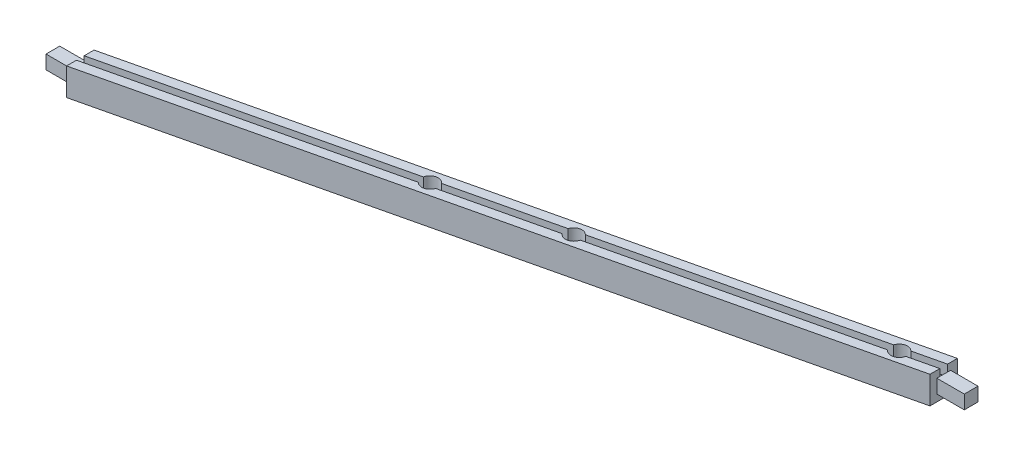
ISO-10303-21;
HEADER;
FILE_DESCRIPTION(('STEP AP214'),'2;1');
FILE_NAME('part.step','',(''),(''),'','','');
FILE_SCHEMA(('AUTOMOTIVE_DESIGN { 1 0 10303 214 1 1 1 1 }'));
ENDSEC;
DATA;
#1=APPLICATION_CONTEXT('core data for automotive mechanical design processes');
#2=APPLICATION_PROTOCOL_DEFINITION('international standard','automotive_design',2000,#1);
#3=PRODUCT_CONTEXT('',#1,'mechanical');
#4=PRODUCT('Part','Part','',(#3));
#5=PRODUCT_RELATED_PRODUCT_CATEGORY('part','',(#4));
#6=PRODUCT_DEFINITION_FORMATION('','',#4);
#7=PRODUCT_DEFINITION_CONTEXT('part definition',#1,'design');
#8=PRODUCT_DEFINITION('design','',#6,#7);
#9=PRODUCT_DEFINITION_SHAPE('','',#8);
#10=(LENGTH_UNIT() NAMED_UNIT(*) SI_UNIT(.MILLI.,.METRE.));
#11=(NAMED_UNIT(*) PLANE_ANGLE_UNIT() SI_UNIT($,.RADIAN.));
#12=(NAMED_UNIT(*) SI_UNIT($,.STERADIAN.) SOLID_ANGLE_UNIT());
#13=UNCERTAINTY_MEASURE_WITH_UNIT(LENGTH_MEASURE(1.E-05),#10,'distance_accuracy_value','');
#14=(GEOMETRIC_REPRESENTATION_CONTEXT(3) GLOBAL_UNCERTAINTY_ASSIGNED_CONTEXT((#13)) GLOBAL_UNIT_ASSIGNED_CONTEXT((#10,
#11,#12)) REPRESENTATION_CONTEXT('',''));
#15=CARTESIAN_POINT('',(0.,0.,0.));
#16=DIRECTION('',(0.,0.,1.));
#17=DIRECTION('',(1.,0.,0.));
#18=AXIS2_PLACEMENT_3D('',#15,#16,#17);
#19=CARTESIAN_POINT('',(0.,5.,0.));
#20=DIRECTION('',(0.,1.,0.));
#21=DIRECTION('',(0.,0.,1.));
#22=AXIS2_PLACEMENT_3D('',#19,#20,#21);
#23=PLANE('',#22);
#24=DIRECTION('',(-0.973336888209918,0.,0.22938025645167));
#25=VECTOR('',#24,1.);
#26=CARTESIAN_POINT('',(127.3,5.,-33.2020613610787));
#27=LINE('',#26,#25);
#28=CARTESIAN_POINT('',(127.3,5.,-33.2020613610787));
#29=VERTEX_POINT('',#28);
#30=CARTESIAN_POINT('',(121.892366515107,5.,-31.9276779789358));
#31=VERTEX_POINT('',#30);
#32=EDGE_CURVE('E268',#29,#31,#27,.T.);
#33=ORIENTED_EDGE('',*,*,#32,.F.);
#34=DIRECTION('',(0.,0.,-1.));
#35=VECTOR('',#34,1.);
#36=CARTESIAN_POINT('',(127.3,5.,0.));
#37=LINE('',#36,#35);
#38=CARTESIAN_POINT('',(127.3,5.,-35.));
#39=VERTEX_POINT('',#38);
#40=EDGE_CURVE('E410',#29,#39,#37,.T.);
#41=ORIENTED_EDGE('',*,*,#40,.T.);
#42=DIRECTION('',(-0.973336888209918,0.,0.22938025645167));
#43=VECTOR('',#42,1.);
#44=CARTESIAN_POINT('',(-1.11632132515731,5.,-4.73692348975083));
#45=LINE('',#44,#43);
#46=CARTESIAN_POINT('',(0.,5.,-5.));
#47=VERTEX_POINT('',#46);
#48=EDGE_CURVE('E409',#39,#47,#45,.T.);
#49=ORIENTED_EDGE('',*,*,#48,.T.);
#50=DIRECTION('',(0.,0.,-1.));
#51=VECTOR('',#50,1.);
#52=CARTESIAN_POINT('',(0.,5.,0.));
#53=LINE('',#52,#51);
#54=CARTESIAN_POINT('',(0.,5.,-3.20206136107874));
#55=VERTEX_POINT('',#54);
#56=EDGE_CURVE('E413',#55,#47,#53,.T.);
#57=ORIENTED_EDGE('',*,*,#56,.F.);
#58=CARTESIAN_POINT('',(50.0276332522524,5.,-14.9917628345082));
#59=VERTEX_POINT('',#58);
#60=EDGE_CURVE('E272',#59,#55,#27,.T.);
#61=ORIENTED_EDGE('',*,*,#60,.F.);
#62=CARTESIAN_POINT('',(51.5,5.,-14.7051687659598));
#63=DIRECTION('',(0.,-1.,0.));
#64=DIRECTION('',(0.,0.,-1.));
#65=AXIS2_PLACEMENT_3D('',#62,#63,#64);
#66=CIRCLE('',#65,1.5);
#67=CARTESIAN_POINT('',(52.6894562772722,5.,-15.6190581271287));
#68=VERTEX_POINT('',#67);
#69=EDGE_CURVE('E315',#59,#68,#66,.T.);
#70=ORIENTED_EDGE('',*,*,#69,.T.);
#71=CARTESIAN_POINT('',(71.3635631002158,5.,-20.0198688473825));
#72=VERTEX_POINT('',#71);
#73=EDGE_CURVE('E802',#72,#68,#27,.T.);
#74=ORIENTED_EDGE('',*,*,#73,.F.);
#75=CARTESIAN_POINT('',(72.8,5.,-19.5878398750457));
#76=DIRECTION('',(0.,-1.,0.));
#77=DIRECTION('',(0.,0.,-1.));
#78=AXIS2_PLACEMENT_3D('',#75,#76,#77);
#79=CIRCLE('',#78,1.5);
#80=CARTESIAN_POINT('',(73.8923665151067,5.,-20.6158162350238));
#81=VERTEX_POINT('',#80);
#82=EDGE_CURVE('E323',#72,#81,#79,.T.);
#83=ORIENTED_EDGE('',*,*,#82,.T.);
#84=CARTESIAN_POINT('',(119.363563100216,5.,-31.3317305912946));
#85=VERTEX_POINT('',#84);
#86=EDGE_CURVE('E271',#85,#81,#27,.T.);
#87=ORIENTED_EDGE('',*,*,#86,.F.);
#88=CARTESIAN_POINT('',(120.8,5.,-30.8997016189577));
#89=DIRECTION('',(0.,-1.,0.));
#90=DIRECTION('',(0.,0.,-1.));
#91=AXIS2_PLACEMENT_3D('',#88,#89,#90);
#92=CIRCLE('',#91,1.5);
#93=EDGE_CURVE('E330',#85,#31,#92,.T.);
#94=ORIENTED_EDGE('',*,*,#93,.T.);
#95=EDGE_LOOP('',(#33,#41,#49,#57,#61,#70,#74,#83,#87,#94));
#96=FACE_BOUND('',#95,.T.);
#97=ADVANCED_FACE('F37',(#96),#23,.T.);
#98=CARTESIAN_POINT('',(127.3,5.,0.));
#99=DIRECTION('',(-1.,0.,0.));
#100=DIRECTION('',(0.,0.,1.));
#101=AXIS2_PLACEMENT_3D('',#98,#99,#100);
#102=PLANE('',#101);
#103=ORIENTED_EDGE('',*,*,#40,.F.);
#104=DIRECTION('',(0.,1.,0.));
#105=VECTOR('',#104,1.);
#106=CARTESIAN_POINT('',(127.3,3.,-33.2020613610787));
#107=LINE('',#106,#105);
#108=CARTESIAN_POINT('',(127.3,3.75,-33.2020613610787));
#109=VERTEX_POINT('',#108);
#110=EDGE_CURVE('E279',#109,#29,#107,.T.);
#111=ORIENTED_EDGE('',*,*,#110,.F.);
#112=DIRECTION('',(0.,0.,1.));
#113=VECTOR('',#112,1.);
#114=CARTESIAN_POINT('',(127.3,3.75,-31.25));
#115=LINE('',#114,#113);
#116=CARTESIAN_POINT('',(127.3,3.75,-33.75));
#117=VERTEX_POINT('',#116);
#118=EDGE_CURVE('E375',#117,#109,#115,.T.);
#119=ORIENTED_EDGE('',*,*,#118,.F.);
#120=DIRECTION('',(0.,1.,0.));
#121=VECTOR('',#120,1.);
#122=CARTESIAN_POINT('',(127.3,3.75,-33.75));
#123=LINE('',#122,#121);
#124=CARTESIAN_POINT('',(127.3,1.25,-33.75));
#125=VERTEX_POINT('',#124);
#126=EDGE_CURVE('E387',#125,#117,#123,.T.);
#127=ORIENTED_EDGE('',*,*,#126,.F.);
#128=DIRECTION('',(0.,0.,-1.));
#129=VECTOR('',#128,1.);
#130=CARTESIAN_POINT('',(127.3,1.25,-31.25));
#131=LINE('',#130,#129);
#132=CARTESIAN_POINT('',(127.3,1.25,-31.25));
#133=VERTEX_POINT('',#132);
#134=EDGE_CURVE('E384',#133,#125,#131,.T.);
#135=ORIENTED_EDGE('',*,*,#134,.F.);
#136=DIRECTION('',(0.,-1.,0.));
#137=VECTOR('',#136,1.);
#138=CARTESIAN_POINT('',(127.3,3.75,-31.25));
#139=LINE('',#138,#137);
#140=CARTESIAN_POINT('',(127.3,3.75,-31.25));
#141=VERTEX_POINT('',#140);
#142=EDGE_CURVE('E370',#141,#133,#139,.T.);
#143=ORIENTED_EDGE('',*,*,#142,.F.);
#144=CARTESIAN_POINT('',(127.3,3.75,-31.7979386389213));
#145=VERTEX_POINT('',#144);
#146=EDGE_CURVE('E390',#145,#141,#115,.T.);
#147=ORIENTED_EDGE('',*,*,#146,.F.);
#148=DIRECTION('',(0.,1.,0.));
#149=VECTOR('',#148,1.);
#150=CARTESIAN_POINT('',(127.3,3.,-31.7979386389213));
#151=LINE('',#150,#149);
#152=CARTESIAN_POINT('',(127.3,5.,-31.7979386389213));
#153=VERTEX_POINT('',#152);
#154=EDGE_CURVE('E283',#145,#153,#151,.T.);
#155=ORIENTED_EDGE('',*,*,#154,.T.);
#156=CARTESIAN_POINT('',(127.3,5.,-30.));
#157=VERTEX_POINT('',#156);
#158=EDGE_CURVE('E406',#157,#153,#37,.T.);
#159=ORIENTED_EDGE('',*,*,#158,.F.);
#160=DIRECTION('',(0.,-1.,0.));
#161=VECTOR('',#160,1.);
#162=CARTESIAN_POINT('',(127.3,5.,-30.));
#163=LINE('',#162,#161);
#164=CARTESIAN_POINT('',(127.3,0.,-30.));
#165=VERTEX_POINT('',#164);
#166=EDGE_CURVE('E419',#157,#165,#163,.T.);
#167=ORIENTED_EDGE('',*,*,#166,.T.);
#168=DIRECTION('',(0.,0.,-1.));
#169=VECTOR('',#168,1.);
#170=CARTESIAN_POINT('',(127.3,0.,0.));
#171=LINE('',#170,#169);
#172=CARTESIAN_POINT('',(127.3,0.,-35.));
#173=VERTEX_POINT('',#172);
#174=EDGE_CURVE('E405',#165,#173,#171,.T.);
#175=ORIENTED_EDGE('',*,*,#174,.T.);
#176=DIRECTION('',(0.,-1.,0.));
#177=VECTOR('',#176,1.);
#178=CARTESIAN_POINT('',(127.3,5.,-35.));
#179=LINE('',#178,#177);
#180=EDGE_CURVE('E436',#39,#173,#179,.T.);
#181=ORIENTED_EDGE('',*,*,#180,.F.);
#182=EDGE_LOOP('',(#103,#111,#119,#127,#135,#143,#147,#155,#159,#167,#175,#181));
#183=FACE_BOUND('',#182,.T.);
#184=ADVANCED_FACE('F39',(#183),#102,.F.);
#185=CARTESIAN_POINT('',(-1.11632132515731,5.,-4.73692348975083));
#186=DIRECTION('',(0.22938025645167,0.,0.973336888209918));
#187=DIRECTION('',(0.973336888209918,0.,-0.22938025645167));
#188=AXIS2_PLACEMENT_3D('',#185,#186,#187);
#189=PLANE('',#188);
#190=DIRECTION('',(-0.973336888209918,0.,0.22938025645167));
#191=VECTOR('',#190,1.);
#192=CARTESIAN_POINT('',(-1.11632132515731,0.,-4.73692348975083));
#193=LINE('',#192,#191);
#194=CARTESIAN_POINT('',(0.,0.,-5.));
#195=VERTEX_POINT('',#194);
#196=EDGE_CURVE('E422',#173,#195,#193,.T.);
#197=ORIENTED_EDGE('',*,*,#196,.T.);
#198=DIRECTION('',(0.,-1.,0.));
#199=VECTOR('',#198,1.);
#200=CARTESIAN_POINT('',(0.,5.,-5.));
#201=LINE('',#200,#199);
#202=EDGE_CURVE('E434',#47,#195,#201,.T.);
#203=ORIENTED_EDGE('',*,*,#202,.F.);
#204=ORIENTED_EDGE('',*,*,#48,.F.);
#205=ORIENTED_EDGE('',*,*,#180,.T.);
#206=EDGE_LOOP('',(#197,#203,#204,#205));
#207=FACE_BOUND('',#206,.T.);
#208=ADVANCED_FACE('F493',(#207),#189,.F.);
#209=CARTESIAN_POINT('',(0.,5.,0.));
#210=DIRECTION('',(-1.,0.,0.));
#211=DIRECTION('',(0.,0.,1.));
#212=AXIS2_PLACEMENT_3D('',#209,#210,#211);
#213=PLANE('',#212);
#214=DIRECTION('',(0.,1.,0.));
#215=VECTOR('',#214,1.);
#216=CARTESIAN_POINT('',(0.,3.,-3.20206136107874));
#217=LINE('',#216,#215);
#218=CARTESIAN_POINT('',(0.,3.75,-3.20206136107874));
#219=VERTEX_POINT('',#218);
#220=EDGE_CURVE('E250',#219,#55,#217,.T.);
#221=ORIENTED_EDGE('',*,*,#220,.T.);
#222=ORIENTED_EDGE('',*,*,#56,.T.);
#223=ORIENTED_EDGE('',*,*,#202,.T.);
#224=DIRECTION('',(0.,0.,-1.));
#225=VECTOR('',#224,1.);
#226=CARTESIAN_POINT('',(0.,0.,0.));
#227=LINE('',#226,#225);
#228=CARTESIAN_POINT('',(0.,0.,0.));
#229=VERTEX_POINT('',#228);
#230=EDGE_CURVE('E425',#229,#195,#227,.T.);
#231=ORIENTED_EDGE('',*,*,#230,.F.);
#232=DIRECTION('',(0.,-1.,0.));
#233=VECTOR('',#232,1.);
#234=CARTESIAN_POINT('',(0.,5.,0.));
#235=LINE('',#234,#233);
#236=CARTESIAN_POINT('',(0.,5.,0.));
#237=VERTEX_POINT('',#236);
#238=EDGE_CURVE('E432',#237,#229,#235,.T.);
#239=ORIENTED_EDGE('',*,*,#238,.F.);
#240=CARTESIAN_POINT('',(0.,5.,-1.79793863892127));
#241=VERTEX_POINT('',#240);
#242=EDGE_CURVE('E414',#237,#241,#53,.T.);
#243=ORIENTED_EDGE('',*,*,#242,.T.);
#244=DIRECTION('',(0.,1.,0.));
#245=VECTOR('',#244,1.);
#246=CARTESIAN_POINT('',(0.,3.,-1.79793863892127));
#247=LINE('',#246,#245);
#248=CARTESIAN_POINT('',(0.,3.75,-1.79793863892127));
#249=VERTEX_POINT('',#248);
#250=EDGE_CURVE('E253',#249,#241,#247,.T.);
#251=ORIENTED_EDGE('',*,*,#250,.F.);
#252=DIRECTION('',(0.,0.,-1.));
#253=VECTOR('',#252,1.);
#254=CARTESIAN_POINT('',(0.,3.75,-3.75));
#255=LINE('',#254,#253);
#256=CARTESIAN_POINT('',(0.,3.75,-1.25));
#257=VERTEX_POINT('',#256);
#258=EDGE_CURVE('E339',#257,#249,#255,.T.);
#259=ORIENTED_EDGE('',*,*,#258,.F.);
#260=DIRECTION('',(0.,1.,0.));
#261=VECTOR('',#260,1.);
#262=CARTESIAN_POINT('',(0.,3.75,-1.25));
#263=LINE('',#262,#261);
#264=CARTESIAN_POINT('',(0.,1.25,-1.25));
#265=VERTEX_POINT('',#264);
#266=EDGE_CURVE('E352',#265,#257,#263,.T.);
#267=ORIENTED_EDGE('',*,*,#266,.F.);
#268=DIRECTION('',(0.,0.,1.));
#269=VECTOR('',#268,1.);
#270=CARTESIAN_POINT('',(0.,1.25,-3.75));
#271=LINE('',#270,#269);
#272=CARTESIAN_POINT('',(0.,1.25,-3.75));
#273=VERTEX_POINT('',#272);
#274=EDGE_CURVE('E349',#273,#265,#271,.T.);
#275=ORIENTED_EDGE('',*,*,#274,.F.);
#276=DIRECTION('',(0.,-1.,0.));
#277=VECTOR('',#276,1.);
#278=CARTESIAN_POINT('',(0.,3.75,-3.75));
#279=LINE('',#278,#277);
#280=CARTESIAN_POINT('',(0.,3.75,-3.75));
#281=VERTEX_POINT('',#280);
#282=EDGE_CURVE('E346',#281,#273,#279,.T.);
#283=ORIENTED_EDGE('',*,*,#282,.F.);
#284=EDGE_CURVE('E355',#219,#281,#255,.T.);
#285=ORIENTED_EDGE('',*,*,#284,.F.);
#286=EDGE_LOOP('',(#221,#222,#223,#231,#239,#243,#251,#259,#267,#275,#283,#285));
#287=FACE_BOUND('',#286,.T.);
#288=ADVANCED_FACE('F549',(#287),#213,.T.);
#289=CARTESIAN_POINT('',(0.,5.,0.));
#290=DIRECTION('',(-0.22938025645167,0.,-0.973336888209918));
#291=DIRECTION('',(-0.973336888209918,0.,0.22938025645167));
#292=AXIS2_PLACEMENT_3D('',#289,#290,#291);
#293=PLANE('',#292);
#294=DIRECTION('',(0.973336888209918,0.,-0.22938025645167));
#295=VECTOR('',#294,1.);
#296=CARTESIAN_POINT('',(0.,0.,0.));
#297=LINE('',#296,#295);
#298=EDGE_CURVE('E428',#229,#165,#297,.T.);
#299=ORIENTED_EDGE('',*,*,#298,.T.);
#300=ORIENTED_EDGE('',*,*,#166,.F.);
#301=DIRECTION('',(0.973336888209918,0.,-0.22938025645167));
#302=VECTOR('',#301,1.);
#303=CARTESIAN_POINT('',(0.,5.,0.));
#304=LINE('',#303,#302);
#305=EDGE_CURVE('E417',#237,#157,#304,.T.);
#306=ORIENTED_EDGE('',*,*,#305,.F.);
#307=ORIENTED_EDGE('',*,*,#238,.T.);
#308=EDGE_LOOP('',(#299,#300,#306,#307));
#309=FACE_BOUND('',#308,.T.);
#310=ADVANCED_FACE('F483',(#309),#293,.F.);
#311=DIRECTION('',(0.973336888209918,0.,-0.22938025645167));
#312=VECTOR('',#311,1.);
#313=CARTESIAN_POINT('',(0.,5.,-1.79793863892127));
#314=LINE('',#313,#312);
#315=CARTESIAN_POINT('',(50.4076334848933,5.,-13.6771924059817));
#316=VERTEX_POINT('',#315);
#317=EDGE_CURVE('E244',#241,#316,#314,.T.);
#318=ORIENTED_EDGE('',*,*,#317,.F.);
#319=ORIENTED_EDGE('',*,*,#242,.F.);
#320=ORIENTED_EDGE('',*,*,#305,.T.);
#321=ORIENTED_EDGE('',*,*,#158,.T.);
#322=CARTESIAN_POINT('',(122.272366747748,5.,-30.6131075504093));
#323=VERTEX_POINT('',#322);
#324=EDGE_CURVE('E270',#323,#153,#314,.T.);
#325=ORIENTED_EDGE('',*,*,#324,.F.);
#326=CARTESIAN_POINT('',(119.610543722728,5.,-29.9858122577888));
#327=VERTEX_POINT('',#326);
#328=EDGE_CURVE('E329',#323,#327,#92,.T.);
#329=ORIENTED_EDGE('',*,*,#328,.T.);
#330=CARTESIAN_POINT('',(74.2723667477476,5.,-19.3012458064973));
#331=VERTEX_POINT('',#330);
#332=EDGE_CURVE('E464',#331,#327,#314,.T.);
#333=ORIENTED_EDGE('',*,*,#332,.F.);
#334=CARTESIAN_POINT('',(71.6105437227278,5.,-18.6739505138768));
#335=VERTEX_POINT('',#334);
#336=EDGE_CURVE('E322',#331,#335,#79,.T.);
#337=ORIENTED_EDGE('',*,*,#336,.T.);
#338=CARTESIAN_POINT('',(52.9364368997842,5.,-14.273139793623));
#339=VERTEX_POINT('',#338);
#340=EDGE_CURVE('E274',#339,#335,#314,.T.);
#341=ORIENTED_EDGE('',*,*,#340,.F.);
#342=EDGE_CURVE('E318',#339,#316,#66,.T.);
#343=ORIENTED_EDGE('',*,*,#342,.T.);
#344=EDGE_LOOP('',(#318,#319,#320,#321,#325,#329,#333,#337,#341,#343));
#345=FACE_BOUND('',#344,.T.);
#346=ADVANCED_FACE('F458',(#345),#23,.T.);
#347=CARTESIAN_POINT('',(0.,0.,0.));
#348=DIRECTION('',(0.,1.,0.));
#349=DIRECTION('',(0.,0.,1.));
#350=AXIS2_PLACEMENT_3D('',#347,#348,#349);
#351=PLANE('',#350);
#352=CARTESIAN_POINT('',(51.5,0.,-14.7051687659598));
#353=DIRECTION('',(0.,-1.,0.));
#354=DIRECTION('',(0.,0.,-1.));
#355=AXIS2_PLACEMENT_3D('',#352,#353,#354);
#356=CIRCLE('',#355,1.5);
#357=CARTESIAN_POINT('',(51.5,0.,-16.2051687659598));
#358=VERTEX_POINT('',#357);
#359=EDGE_CURVE('E319',#358,#358,#356,.T.);
#360=ORIENTED_EDGE('',*,*,#359,.F.);
#361=EDGE_LOOP('',(#360));
#362=FACE_BOUND('',#361,.T.);
#363=CARTESIAN_POINT('',(72.8,0.,-19.5878398750457));
#364=DIRECTION('',(0.,-1.,0.));
#365=DIRECTION('',(0.,0.,-1.));
#366=AXIS2_PLACEMENT_3D('',#363,#364,#365);
#367=CIRCLE('',#366,1.5);
#368=CARTESIAN_POINT('',(72.8,0.,-21.0878398750457));
#369=VERTEX_POINT('',#368);
#370=EDGE_CURVE('E326',#369,#369,#367,.T.);
#371=ORIENTED_EDGE('',*,*,#370,.F.);
#372=EDGE_LOOP('',(#371));
#373=FACE_BOUND('',#372,.T.);
#374=CARTESIAN_POINT('',(120.8,0.,-30.8997016189577));
#375=DIRECTION('',(0.,-1.,0.));
#376=DIRECTION('',(0.,0.,-1.));
#377=AXIS2_PLACEMENT_3D('',#374,#375,#376);
#378=CIRCLE('',#377,1.5);
#379=CARTESIAN_POINT('',(120.8,0.,-32.3997016189577));
#380=VERTEX_POINT('',#379);
#381=EDGE_CURVE('E314',#380,#380,#378,.T.);
#382=ORIENTED_EDGE('',*,*,#381,.F.);
#383=EDGE_LOOP('',(#382));
#384=FACE_BOUND('',#383,.T.);
#385=ORIENTED_EDGE('',*,*,#174,.F.);
#386=ORIENTED_EDGE('',*,*,#298,.F.);
#387=ORIENTED_EDGE('',*,*,#230,.T.);
#388=ORIENTED_EDGE('',*,*,#196,.F.);
#389=EDGE_LOOP('',(#385,#386,#387,#388));
#390=FACE_BOUND('',#389,.T.);
#391=ADVANCED_FACE('F488',(#362,#373,#384,#390),#351,.F.);
#392=CARTESIAN_POINT('',(132.3,3.75,-31.25));
#393=DIRECTION('',(0.,0.,-1.));
#394=DIRECTION('',(-1.,0.,0.));
#395=AXIS2_PLACEMENT_3D('',#392,#393,#394);
#396=PLANE('',#395);
#397=ORIENTED_EDGE('',*,*,#142,.T.);
#398=DIRECTION('',(-1.,0.,0.));
#399=VECTOR('',#398,1.);
#400=CARTESIAN_POINT('',(132.3,1.25,-31.25));
#401=LINE('',#400,#399);
#402=CARTESIAN_POINT('',(132.3,1.25,-31.25));
#403=VERTEX_POINT('',#402);
#404=EDGE_CURVE('E402',#403,#133,#401,.T.);
#405=ORIENTED_EDGE('',*,*,#404,.F.);
#406=DIRECTION('',(0.,-1.,0.));
#407=VECTOR('',#406,1.);
#408=CARTESIAN_POINT('',(132.3,3.75,-31.25));
#409=LINE('',#408,#407);
#410=CARTESIAN_POINT('',(132.3,3.75,-31.25));
#411=VERTEX_POINT('',#410);
#412=EDGE_CURVE('E371',#411,#403,#409,.T.);
#413=ORIENTED_EDGE('',*,*,#412,.F.);
#414=DIRECTION('',(-1.,0.,0.));
#415=VECTOR('',#414,1.);
#416=CARTESIAN_POINT('',(132.3,3.75,-31.25));
#417=LINE('',#416,#415);
#418=EDGE_CURVE('E381',#411,#141,#417,.T.);
#419=ORIENTED_EDGE('',*,*,#418,.T.);
#420=EDGE_LOOP('',(#397,#405,#413,#419));
#421=FACE_BOUND('',#420,.T.);
#422=ADVANCED_FACE('F517',(#421),#396,.F.);
#423=CARTESIAN_POINT('',(132.3,1.25,-31.25));
#424=DIRECTION('',(0.,1.,0.));
#425=DIRECTION('',(0.,0.,1.));
#426=AXIS2_PLACEMENT_3D('',#423,#424,#425);
#427=PLANE('',#426);
#428=ORIENTED_EDGE('',*,*,#134,.T.);
#429=DIRECTION('',(-1.,0.,0.));
#430=VECTOR('',#429,1.);
#431=CARTESIAN_POINT('',(132.3,1.25,-33.75));
#432=LINE('',#431,#430);
#433=CARTESIAN_POINT('',(132.3,1.25,-33.75));
#434=VERTEX_POINT('',#433);
#435=EDGE_CURVE('E399',#434,#125,#432,.T.);
#436=ORIENTED_EDGE('',*,*,#435,.F.);
#437=DIRECTION('',(0.,0.,-1.));
#438=VECTOR('',#437,1.);
#439=CARTESIAN_POINT('',(132.3,1.25,-31.25));
#440=LINE('',#439,#438);
#441=EDGE_CURVE('E374',#403,#434,#440,.T.);
#442=ORIENTED_EDGE('',*,*,#441,.F.);
#443=ORIENTED_EDGE('',*,*,#404,.T.);
#444=EDGE_LOOP('',(#428,#436,#442,#443));
#445=FACE_BOUND('',#444,.T.);
#446=ADVANCED_FACE('F526',(#445),#427,.F.);
#447=CARTESIAN_POINT('',(132.3,3.75,-33.75));
#448=DIRECTION('',(0.,0.,1.));
#449=DIRECTION('',(1.,0.,0.));
#450=AXIS2_PLACEMENT_3D('',#447,#448,#449);
#451=PLANE('',#450);
#452=ORIENTED_EDGE('',*,*,#126,.T.);
#453=DIRECTION('',(-1.,0.,0.));
#454=VECTOR('',#453,1.);
#455=CARTESIAN_POINT('',(132.3,3.75,-33.75));
#456=LINE('',#455,#454);
#457=CARTESIAN_POINT('',(132.3,3.75,-33.75));
#458=VERTEX_POINT('',#457);
#459=EDGE_CURVE('E396',#458,#117,#456,.T.);
#460=ORIENTED_EDGE('',*,*,#459,.F.);
#461=DIRECTION('',(0.,1.,0.));
#462=VECTOR('',#461,1.);
#463=CARTESIAN_POINT('',(132.3,3.75,-33.75));
#464=LINE('',#463,#462);
#465=EDGE_CURVE('E377',#434,#458,#464,.T.);
#466=ORIENTED_EDGE('',*,*,#465,.F.);
#467=ORIENTED_EDGE('',*,*,#435,.T.);
#468=EDGE_LOOP('',(#452,#460,#466,#467));
#469=FACE_BOUND('',#468,.T.);
#470=ADVANCED_FACE('F524',(#469),#451,.F.);
#471=CARTESIAN_POINT('',(132.3,3.75,-31.25));
#472=DIRECTION('',(0.,-1.,0.));
#473=DIRECTION('',(0.,0.,-1.));
#474=AXIS2_PLACEMENT_3D('',#471,#472,#473);
#475=PLANE('',#474);
#476=ORIENTED_EDGE('',*,*,#118,.T.);
#477=EDGE_CURVE('E393',#109,#145,#115,.T.);
#478=ORIENTED_EDGE('',*,*,#477,.T.);
#479=ORIENTED_EDGE('',*,*,#146,.T.);
#480=ORIENTED_EDGE('',*,*,#418,.F.);
#481=DIRECTION('',(0.,0.,1.));
#482=VECTOR('',#481,1.);
#483=CARTESIAN_POINT('',(132.3,3.75,-31.25));
#484=LINE('',#483,#482);
#485=EDGE_CURVE('E379',#458,#411,#484,.T.);
#486=ORIENTED_EDGE('',*,*,#485,.F.);
#487=ORIENTED_EDGE('',*,*,#459,.T.);
#488=EDGE_LOOP('',(#476,#478,#479,#480,#486,#487));
#489=FACE_BOUND('',#488,.T.);
#490=ADVANCED_FACE('F512',(#489),#475,.F.);
#491=CARTESIAN_POINT('',(132.3,0.,0.));
#492=DIRECTION('',(1.,0.,0.));
#493=DIRECTION('',(0.,0.,-1.));
#494=AXIS2_PLACEMENT_3D('',#491,#492,#493);
#495=PLANE('',#494);
#496=ORIENTED_EDGE('',*,*,#412,.T.);
#497=ORIENTED_EDGE('',*,*,#441,.T.);
#498=ORIENTED_EDGE('',*,*,#465,.T.);
#499=ORIENTED_EDGE('',*,*,#485,.T.);
#500=EDGE_LOOP('',(#496,#497,#498,#499));
#501=FACE_BOUND('',#500,.T.);
#502=ADVANCED_FACE('F519',(#501),#495,.T.);
#503=CARTESIAN_POINT('',(-5.,3.75,-3.75));
#504=DIRECTION('',(0.,0.,1.));
#505=DIRECTION('',(0.,-1.,0.));
#506=AXIS2_PLACEMENT_3D('',#503,#504,#505);
#507=PLANE('',#506);
#508=ORIENTED_EDGE('',*,*,#282,.T.);
#509=DIRECTION('',(1.,0.,0.));
#510=VECTOR('',#509,1.);
#511=CARTESIAN_POINT('',(-5.,1.25,-3.75));
#512=LINE('',#511,#510);
#513=CARTESIAN_POINT('',(-5.,1.25,-3.75));
#514=VERTEX_POINT('',#513);
#515=EDGE_CURVE('E367',#514,#273,#512,.T.);
#516=ORIENTED_EDGE('',*,*,#515,.F.);
#517=DIRECTION('',(0.,-1.,0.));
#518=VECTOR('',#517,1.);
#519=CARTESIAN_POINT('',(-5.,3.75,-3.75));
#520=LINE('',#519,#518);
#521=CARTESIAN_POINT('',(-5.,3.75,-3.75));
#522=VERTEX_POINT('',#521);
#523=EDGE_CURVE('E335',#522,#514,#520,.T.);
#524=ORIENTED_EDGE('',*,*,#523,.F.);
#525=DIRECTION('',(1.,0.,0.));
#526=VECTOR('',#525,1.);
#527=CARTESIAN_POINT('',(-5.,3.75,-3.75));
#528=LINE('',#527,#526);
#529=EDGE_CURVE('E345',#522,#281,#528,.T.);
#530=ORIENTED_EDGE('',*,*,#529,.T.);
#531=EDGE_LOOP('',(#508,#516,#524,#530));
#532=FACE_BOUND('',#531,.T.);
#533=ADVANCED_FACE('F606',(#532),#507,.F.);
#534=CARTESIAN_POINT('',(-5.,1.25,-3.75));
#535=DIRECTION('',(0.,1.,0.));
#536=DIRECTION('',(0.,0.,1.));
#537=AXIS2_PLACEMENT_3D('',#534,#535,#536);
#538=PLANE('',#537);
#539=ORIENTED_EDGE('',*,*,#274,.T.);
#540=DIRECTION('',(1.,0.,0.));
#541=VECTOR('',#540,1.);
#542=CARTESIAN_POINT('',(-5.,1.25,-1.25));
#543=LINE('',#542,#541);
#544=CARTESIAN_POINT('',(-5.,1.25,-1.25));
#545=VERTEX_POINT('',#544);
#546=EDGE_CURVE('E364',#545,#265,#543,.T.);
#547=ORIENTED_EDGE('',*,*,#546,.F.);
#548=DIRECTION('',(0.,0.,1.));
#549=VECTOR('',#548,1.);
#550=CARTESIAN_POINT('',(-5.,1.25,-3.75));
#551=LINE('',#550,#549);
#552=EDGE_CURVE('E338',#514,#545,#551,.T.);
#553=ORIENTED_EDGE('',*,*,#552,.F.);
#554=ORIENTED_EDGE('',*,*,#515,.T.);
#555=EDGE_LOOP('',(#539,#547,#553,#554));
#556=FACE_BOUND('',#555,.T.);
#557=ADVANCED_FACE('F614',(#556),#538,.F.);
#558=CARTESIAN_POINT('',(-5.,3.75,-1.25));
#559=DIRECTION('',(0.,0.,-1.));
#560=DIRECTION('',(0.,1.,0.));
#561=AXIS2_PLACEMENT_3D('',#558,#559,#560);
#562=PLANE('',#561);
#563=ORIENTED_EDGE('',*,*,#266,.T.);
#564=DIRECTION('',(1.,0.,0.));
#565=VECTOR('',#564,1.);
#566=CARTESIAN_POINT('',(-5.,3.75,-1.25));
#567=LINE('',#566,#565);
#568=CARTESIAN_POINT('',(-5.,3.75,-1.25));
#569=VERTEX_POINT('',#568);
#570=EDGE_CURVE('E361',#569,#257,#567,.T.);
#571=ORIENTED_EDGE('',*,*,#570,.F.);
#572=DIRECTION('',(0.,1.,0.));
#573=VECTOR('',#572,1.);
#574=CARTESIAN_POINT('',(-5.,3.75,-1.25));
#575=LINE('',#574,#573);
#576=EDGE_CURVE('E341',#545,#569,#575,.T.);
#577=ORIENTED_EDGE('',*,*,#576,.F.);
#578=ORIENTED_EDGE('',*,*,#546,.T.);
#579=EDGE_LOOP('',(#563,#571,#577,#578));
#580=FACE_BOUND('',#579,.T.);
#581=ADVANCED_FACE('F623',(#580),#562,.F.);
#582=CARTESIAN_POINT('',(-5.,3.75,-3.75));
#583=DIRECTION('',(0.,-1.,0.));
#584=DIRECTION('',(0.,0.,-1.));
#585=AXIS2_PLACEMENT_3D('',#582,#583,#584);
#586=PLANE('',#585);
#587=ORIENTED_EDGE('',*,*,#258,.T.);
#588=EDGE_CURVE('E358',#249,#219,#255,.T.);
#589=ORIENTED_EDGE('',*,*,#588,.T.);
#590=ORIENTED_EDGE('',*,*,#284,.T.);
#591=ORIENTED_EDGE('',*,*,#529,.F.);
#592=DIRECTION('',(0.,0.,-1.));
#593=VECTOR('',#592,1.);
#594=CARTESIAN_POINT('',(-5.,3.75,-3.75));
#595=LINE('',#594,#593);
#596=EDGE_CURVE('E343',#569,#522,#595,.T.);
#597=ORIENTED_EDGE('',*,*,#596,.F.);
#598=ORIENTED_EDGE('',*,*,#570,.T.);
#599=EDGE_LOOP('',(#587,#589,#590,#591,#597,#598));
#600=FACE_BOUND('',#599,.T.);
#601=ADVANCED_FACE('F632',(#600),#586,.F.);
#602=CARTESIAN_POINT('',(-5.,0.,0.));
#603=DIRECTION('',(-1.,0.,0.));
#604=DIRECTION('',(0.,0.,1.));
#605=AXIS2_PLACEMENT_3D('',#602,#603,#604);
#606=PLANE('',#605);
#607=ORIENTED_EDGE('',*,*,#523,.T.);
#608=ORIENTED_EDGE('',*,*,#552,.T.);
#609=ORIENTED_EDGE('',*,*,#576,.T.);
#610=ORIENTED_EDGE('',*,*,#596,.T.);
#611=EDGE_LOOP('',(#607,#608,#609,#610));
#612=FACE_BOUND('',#611,.T.);
#613=ADVANCED_FACE('F641',(#612),#606,.T.);
#614=CARTESIAN_POINT('',(120.8,5.,-30.8997016189577));
#615=DIRECTION('',(0.,-1.,0.));
#616=DIRECTION('',(0.,0.,-1.));
#617=AXIS2_PLACEMENT_3D('',#614,#615,#616);
#618=CYLINDRICAL_SURFACE('',#617,1.5);
#619=ORIENTED_EDGE('',*,*,#93,.F.);
#620=DIRECTION('',(0.,-1.,0.));
#621=VECTOR('',#620,1.);
#622=CARTESIAN_POINT('',(119.363563100216,5.,-31.3317305912946));
#623=LINE('',#622,#621);
#624=CARTESIAN_POINT('',(119.363563100216,3.,-31.3317305912946));
#625=VERTEX_POINT('',#624);
#626=EDGE_CURVE('E308',#85,#625,#623,.T.);
#627=ORIENTED_EDGE('',*,*,#626,.T.);
#628=CARTESIAN_POINT('',(120.8,3.,-30.8997016189577));
#629=DIRECTION('',(0.,1.,0.));
#630=DIRECTION('',(0.,0.,1.));
#631=AXIS2_PLACEMENT_3D('',#628,#629,#630);
#632=CIRCLE('',#631,1.5);
#633=CARTESIAN_POINT('',(119.610543722728,3.,-29.9858122577888));
#634=VERTEX_POINT('',#633);
#635=EDGE_CURVE('E289',#634,#625,#632,.F.);
#636=ORIENTED_EDGE('',*,*,#635,.F.);
#637=DIRECTION('',(0.,-1.,0.));
#638=VECTOR('',#637,1.);
#639=CARTESIAN_POINT('',(119.610543722728,5.,-29.9858122577888));
#640=LINE('',#639,#638);
#641=EDGE_CURVE('E299',#634,#327,#640,.F.);
#642=ORIENTED_EDGE('',*,*,#641,.T.);
#643=ORIENTED_EDGE('',*,*,#328,.F.);
#644=DIRECTION('',(0.,-1.,0.));
#645=VECTOR('',#644,1.);
#646=CARTESIAN_POINT('',(122.272366747748,5.,-30.6131075504093));
#647=LINE('',#646,#645);
#648=CARTESIAN_POINT('',(122.272366747748,3.,-30.6131075504093));
#649=VERTEX_POINT('',#648);
#650=EDGE_CURVE('E296',#323,#649,#647,.T.);
#651=ORIENTED_EDGE('',*,*,#650,.T.);
#652=CARTESIAN_POINT('',(121.892366515107,3.,-31.9276779789358));
#653=VERTEX_POINT('',#652);
#654=EDGE_CURVE('E287',#653,#649,#632,.F.);
#655=ORIENTED_EDGE('',*,*,#654,.F.);
#656=DIRECTION('',(0.,-1.,0.));
#657=VECTOR('',#656,1.);
#658=CARTESIAN_POINT('',(121.892366515107,5.,-31.9276779789358));
#659=LINE('',#658,#657);
#660=EDGE_CURVE('E311',#653,#31,#659,.F.);
#661=ORIENTED_EDGE('',*,*,#660,.T.);
#662=EDGE_LOOP('',(#619,#627,#636,#642,#643,#651,#655,#661));
#663=FACE_BOUND('',#662,.T.);
#664=ORIENTED_EDGE('',*,*,#381,.T.);
#665=EDGE_LOOP('',(#664));
#666=FACE_BOUND('',#665,.T.);
#667=ADVANCED_FACE('F504',(#663,#666),#618,.F.);
#668=CARTESIAN_POINT('',(72.8,5.,-19.5878398750457));
#669=DIRECTION('',(0.,-1.,0.));
#670=DIRECTION('',(0.,0.,-1.));
#671=AXIS2_PLACEMENT_3D('',#668,#669,#670);
#672=CYLINDRICAL_SURFACE('',#671,1.5);
#673=ORIENTED_EDGE('',*,*,#82,.F.);
#674=DIRECTION('',(0.,-1.,0.));
#675=VECTOR('',#674,1.);
#676=CARTESIAN_POINT('',(71.3635631002158,5.,-20.0198688473825));
#677=LINE('',#676,#675);
#678=CARTESIAN_POINT('',(71.3635631002158,3.,-20.0198688473825));
#679=VERTEX_POINT('',#678);
#680=EDGE_CURVE('E302',#72,#679,#677,.T.);
#681=ORIENTED_EDGE('',*,*,#680,.T.);
#682=CARTESIAN_POINT('',(72.8,3.,-19.5878398750457));
#683=DIRECTION('',(0.,1.,0.));
#684=DIRECTION('',(0.,0.,1.));
#685=AXIS2_PLACEMENT_3D('',#682,#683,#684);
#686=CIRCLE('',#685,1.5);
#687=CARTESIAN_POINT('',(71.6105437227278,3.,-18.6739505138768));
#688=VERTEX_POINT('',#687);
#689=EDGE_CURVE('E286',#688,#679,#686,.F.);
#690=ORIENTED_EDGE('',*,*,#689,.F.);
#691=DIRECTION('',(0.,-1.,0.));
#692=VECTOR('',#691,1.);
#693=CARTESIAN_POINT('',(71.6105437227278,5.,-18.6739505138768));
#694=LINE('',#693,#692);
#695=EDGE_CURVE('E293',#688,#335,#694,.F.);
#696=ORIENTED_EDGE('',*,*,#695,.T.);
#697=ORIENTED_EDGE('',*,*,#336,.F.);
#698=DIRECTION('',(0.,-1.,0.));
#699=VECTOR('',#698,1.);
#700=CARTESIAN_POINT('',(74.2723667477476,5.,-19.3012458064973));
#701=LINE('',#700,#699);
#702=CARTESIAN_POINT('',(74.2723667477476,3.,-19.3012458064973));
#703=VERTEX_POINT('',#702);
#704=EDGE_CURVE('E290',#331,#703,#701,.T.);
#705=ORIENTED_EDGE('',*,*,#704,.T.);
#706=CARTESIAN_POINT('',(73.8923665151067,3.,-20.6158162350238));
#707=VERTEX_POINT('',#706);
#708=EDGE_CURVE('E278',#707,#703,#686,.F.);
#709=ORIENTED_EDGE('',*,*,#708,.F.);
#710=DIRECTION('',(0.,-1.,0.));
#711=VECTOR('',#710,1.);
#712=CARTESIAN_POINT('',(73.8923665151067,5.,-20.6158162350238));
#713=LINE('',#712,#711);
#714=EDGE_CURVE('E305',#707,#81,#713,.F.);
#715=ORIENTED_EDGE('',*,*,#714,.T.);
#716=EDGE_LOOP('',(#673,#681,#690,#696,#697,#705,#709,#715));
#717=FACE_BOUND('',#716,.T.);
#718=ORIENTED_EDGE('',*,*,#370,.T.);
#719=EDGE_LOOP('',(#718));
#720=FACE_BOUND('',#719,.T.);
#721=ADVANCED_FACE('F657',(#717,#720),#672,.F.);
#722=CARTESIAN_POINT('',(51.5,5.,-14.7051687659598));
#723=DIRECTION('',(0.,-1.,0.));
#724=DIRECTION('',(0.,0.,-1.));
#725=AXIS2_PLACEMENT_3D('',#722,#723,#724);
#726=CYLINDRICAL_SURFACE('',#725,1.5);
#727=ORIENTED_EDGE('',*,*,#69,.F.);
#728=DIRECTION('',(0.,-1.,0.));
#729=VECTOR('',#728,1.);
#730=CARTESIAN_POINT('',(50.0276332522524,5.,-14.9917628345082));
#731=LINE('',#730,#729);
#732=CARTESIAN_POINT('',(50.0276332522524,3.,-14.9917628345082));
#733=VERTEX_POINT('',#732);
#734=EDGE_CURVE('E11',#59,#733,#731,.T.);
#735=ORIENTED_EDGE('',*,*,#734,.T.);
#736=CARTESIAN_POINT('',(51.5,3.,-14.7051687659598));
#737=DIRECTION('',(0.,1.,0.));
#738=DIRECTION('',(0.,0.,1.));
#739=AXIS2_PLACEMENT_3D('',#736,#737,#738);
#740=CIRCLE('',#739,1.5);
#741=CARTESIAN_POINT('',(50.4076334848933,3.,-13.6771924059817));
#742=VERTEX_POINT('',#741);
#743=EDGE_CURVE('E241',#742,#733,#740,.F.);
#744=ORIENTED_EDGE('',*,*,#743,.F.);
#745=DIRECTION('',(0.,-1.,0.));
#746=VECTOR('',#745,1.);
#747=CARTESIAN_POINT('',(50.4076334848933,5.,-13.6771924059817));
#748=LINE('',#747,#746);
#749=EDGE_CURVE('E45',#742,#316,#748,.F.);
#750=ORIENTED_EDGE('',*,*,#749,.T.);
#751=ORIENTED_EDGE('',*,*,#342,.F.);
#752=DIRECTION('',(0.,-1.,0.));
#753=VECTOR('',#752,1.);
#754=CARTESIAN_POINT('',(52.9364368997842,5.,-14.273139793623));
#755=LINE('',#754,#753);
#756=CARTESIAN_POINT('',(52.9364368997842,3.,-14.273139793623));
#757=VERTEX_POINT('',#756);
#758=EDGE_CURVE('E441',#339,#757,#755,.T.);
#759=ORIENTED_EDGE('',*,*,#758,.T.);
#760=CARTESIAN_POINT('',(52.6894562772722,3.,-15.6190581271287));
#761=VERTEX_POINT('',#760);
#762=EDGE_CURVE('E439',#761,#757,#740,.F.);
#763=ORIENTED_EDGE('',*,*,#762,.F.);
#764=DIRECTION('',(0.,-1.,0.));
#765=VECTOR('',#764,1.);
#766=CARTESIAN_POINT('',(52.6894562772722,5.,-15.6190581271287));
#767=LINE('',#766,#765);
#768=EDGE_CURVE('E444',#761,#68,#767,.F.);
#769=ORIENTED_EDGE('',*,*,#768,.T.);
#770=EDGE_LOOP('',(#727,#735,#744,#750,#751,#759,#763,#769));
#771=FACE_BOUND('',#770,.T.);
#772=ORIENTED_EDGE('',*,*,#359,.T.);
#773=EDGE_LOOP('',(#772));
#774=FACE_BOUND('',#773,.T.);
#775=ADVANCED_FACE('F452',(#771,#774),#726,.F.);
#776=CARTESIAN_POINT('',(0.,3.,0.));
#777=DIRECTION('',(0.,1.,0.));
#778=DIRECTION('',(0.,0.,1.));
#779=AXIS2_PLACEMENT_3D('',#776,#777,#778);
#780=PLANE('',#779);
#781=ORIENTED_EDGE('',*,*,#689,.T.);
#782=DIRECTION('',(-0.973336888209918,0.,0.22938025645167));
#783=VECTOR('',#782,1.);
#784=CARTESIAN_POINT('',(127.3,3.,-33.2020613610787));
#785=LINE('',#784,#783);
#786=EDGE_CURVE('E243',#679,#761,#785,.T.);
#787=ORIENTED_EDGE('',*,*,#786,.T.);
#788=ORIENTED_EDGE('',*,*,#762,.T.);
#789=DIRECTION('',(0.973336888209918,0.,-0.22938025645167));
#790=VECTOR('',#789,1.);
#791=CARTESIAN_POINT('',(0.,3.,-1.79793863892127));
#792=LINE('',#791,#790);
#793=EDGE_CURVE('E266',#757,#688,#792,.T.);
#794=ORIENTED_EDGE('',*,*,#793,.T.);
#795=EDGE_LOOP('',(#781,#787,#788,#794));
#796=FACE_BOUND('',#795,.T.);
#797=ADVANCED_FACE('F672',(#796),#780,.T.);
#798=CARTESIAN_POINT('',(0.,3.,-1.79793863892127));
#799=DIRECTION('',(0.22938025645167,0.,0.973336888209918));
#800=DIRECTION('',(0.973336888209918,0.,-0.22938025645167));
#801=AXIS2_PLACEMENT_3D('',#798,#799,#800);
#802=PLANE('',#801);
#803=ORIENTED_EDGE('',*,*,#793,.F.);
#804=ORIENTED_EDGE('',*,*,#758,.F.);
#805=ORIENTED_EDGE('',*,*,#340,.T.);
#806=ORIENTED_EDGE('',*,*,#695,.F.);
#807=EDGE_LOOP('',(#803,#804,#805,#806));
#808=FACE_BOUND('',#807,.T.);
#809=ADVANCED_FACE('F684',(#808),#802,.F.);
#810=CARTESIAN_POINT('',(127.3,3.,-33.2020613610787));
#811=DIRECTION('',(-0.22938025645167,0.,-0.973336888209918));
#812=DIRECTION('',(-0.973336888209918,0.,0.22938025645167));
#813=AXIS2_PLACEMENT_3D('',#810,#811,#812);
#814=PLANE('',#813);
#815=ORIENTED_EDGE('',*,*,#73,.T.);
#816=ORIENTED_EDGE('',*,*,#768,.F.);
#817=ORIENTED_EDGE('',*,*,#786,.F.);
#818=ORIENTED_EDGE('',*,*,#680,.F.);
#819=EDGE_LOOP('',(#815,#816,#817,#818));
#820=FACE_BOUND('',#819,.T.);
#821=ADVANCED_FACE('F693',(#820),#814,.F.);
#822=ORIENTED_EDGE('',*,*,#743,.T.);
#823=CARTESIAN_POINT('',(0.,3.,-3.20206136107874));
#824=VERTEX_POINT('',#823);
#825=EDGE_CURVE('E235',#733,#824,#785,.T.);
#826=ORIENTED_EDGE('',*,*,#825,.T.);
#827=DIRECTION('',(0.,0.,1.));
#828=VECTOR('',#827,1.);
#829=CARTESIAN_POINT('',(0.,3.,-3.20206136107874));
#830=LINE('',#829,#828);
#831=CARTESIAN_POINT('',(0.,3.,-1.79793863892127));
#832=VERTEX_POINT('',#831);
#833=EDGE_CURVE('E239',#824,#832,#830,.T.);
#834=ORIENTED_EDGE('',*,*,#833,.T.);
#835=EDGE_CURVE('E263',#832,#742,#792,.T.);
#836=ORIENTED_EDGE('',*,*,#835,.T.);
#837=EDGE_LOOP('',(#822,#826,#834,#836));
#838=FACE_BOUND('',#837,.T.);
#839=ADVANCED_FACE('F237',(#838),#780,.T.);
#840=ORIENTED_EDGE('',*,*,#835,.F.);
#841=EDGE_CURVE('E257',#832,#249,#247,.T.);
#842=ORIENTED_EDGE('',*,*,#841,.T.);
#843=ORIENTED_EDGE('',*,*,#250,.T.);
#844=ORIENTED_EDGE('',*,*,#317,.T.);
#845=ORIENTED_EDGE('',*,*,#749,.F.);
#846=EDGE_LOOP('',(#840,#842,#843,#844,#845));
#847=FACE_BOUND('',#846,.T.);
#848=ADVANCED_FACE('F695',(#847),#802,.F.);
#849=ORIENTED_EDGE('',*,*,#60,.T.);
#850=ORIENTED_EDGE('',*,*,#220,.F.);
#851=EDGE_CURVE('E247',#824,#219,#217,.T.);
#852=ORIENTED_EDGE('',*,*,#851,.F.);
#853=ORIENTED_EDGE('',*,*,#825,.F.);
#854=ORIENTED_EDGE('',*,*,#734,.F.);
#855=EDGE_LOOP('',(#849,#850,#852,#853,#854));
#856=FACE_BOUND('',#855,.T.);
#857=ADVANCED_FACE('F248',(#856),#814,.F.);
#858=CARTESIAN_POINT('',(0.,3.,-3.20206136107874));
#859=DIRECTION('',(-1.,0.,0.));
#860=DIRECTION('',(0.,0.,1.));
#861=AXIS2_PLACEMENT_3D('',#858,#859,#860);
#862=PLANE('',#861);
#863=ORIENTED_EDGE('',*,*,#841,.F.);
#864=ORIENTED_EDGE('',*,*,#833,.F.);
#865=ORIENTED_EDGE('',*,*,#851,.T.);
#866=ORIENTED_EDGE('',*,*,#588,.F.);
#867=EDGE_LOOP('',(#863,#864,#865,#866));
#868=FACE_BOUND('',#867,.T.);
#869=ADVANCED_FACE('F255',(#868),#862,.F.);
#870=ORIENTED_EDGE('',*,*,#635,.T.);
#871=EDGE_CURVE('E60',#625,#707,#785,.T.);
#872=ORIENTED_EDGE('',*,*,#871,.T.);
#873=ORIENTED_EDGE('',*,*,#708,.T.);
#874=EDGE_CURVE('E261',#703,#634,#792,.T.);
#875=ORIENTED_EDGE('',*,*,#874,.T.);
#876=EDGE_LOOP('',(#870,#872,#873,#875));
#877=FACE_BOUND('',#876,.T.);
#878=ADVANCED_FACE('F711',(#877),#780,.T.);
#879=ORIENTED_EDGE('',*,*,#874,.F.);
#880=ORIENTED_EDGE('',*,*,#704,.F.);
#881=ORIENTED_EDGE('',*,*,#332,.T.);
#882=ORIENTED_EDGE('',*,*,#641,.F.);
#883=EDGE_LOOP('',(#879,#880,#881,#882));
#884=FACE_BOUND('',#883,.T.);
#885=ADVANCED_FACE('F718',(#884),#802,.F.);
#886=ORIENTED_EDGE('',*,*,#86,.T.);
#887=ORIENTED_EDGE('',*,*,#714,.F.);
#888=ORIENTED_EDGE('',*,*,#871,.F.);
#889=ORIENTED_EDGE('',*,*,#626,.F.);
#890=EDGE_LOOP('',(#886,#887,#888,#889));
#891=FACE_BOUND('',#890,.T.);
#892=ADVANCED_FACE('F704',(#891),#814,.F.);
#893=CARTESIAN_POINT('',(127.3,3.,-31.7979386389213));
#894=DIRECTION('',(1.,0.,0.));
#895=DIRECTION('',(0.,0.,-1.));
#896=AXIS2_PLACEMENT_3D('',#893,#894,#895);
#897=PLANE('',#896);
#898=CARTESIAN_POINT('',(127.3,3.,-33.2020613610787));
#899=VERTEX_POINT('',#898);
#900=EDGE_CURVE('E275',#899,#109,#107,.T.);
#901=ORIENTED_EDGE('',*,*,#900,.F.);
#902=DIRECTION('',(0.,0.,-1.));
#903=VECTOR('',#902,1.);
#904=CARTESIAN_POINT('',(127.3,3.,-31.7979386389213));
#905=LINE('',#904,#903);
#906=CARTESIAN_POINT('',(127.3,3.,-31.7979386389213));
#907=VERTEX_POINT('',#906);
#908=EDGE_CURVE('E265',#907,#899,#905,.T.);
#909=ORIENTED_EDGE('',*,*,#908,.F.);
#910=EDGE_CURVE('E280',#907,#145,#151,.T.);
#911=ORIENTED_EDGE('',*,*,#910,.T.);
#912=ORIENTED_EDGE('',*,*,#477,.F.);
#913=EDGE_LOOP('',(#901,#909,#911,#912));
#914=FACE_BOUND('',#913,.T.);
#915=ADVANCED_FACE('F509',(#914),#897,.F.);
#916=EDGE_CURVE('E52',#899,#653,#785,.T.);
#917=ORIENTED_EDGE('',*,*,#916,.F.);
#918=ORIENTED_EDGE('',*,*,#900,.T.);
#919=ORIENTED_EDGE('',*,*,#110,.T.);
#920=ORIENTED_EDGE('',*,*,#32,.T.);
#921=ORIENTED_EDGE('',*,*,#660,.F.);
#922=EDGE_LOOP('',(#917,#918,#919,#920,#921));
#923=FACE_BOUND('',#922,.T.);
#924=ADVANCED_FACE('F501',(#923),#814,.F.);
#925=ORIENTED_EDGE('',*,*,#324,.T.);
#926=ORIENTED_EDGE('',*,*,#154,.F.);
#927=ORIENTED_EDGE('',*,*,#910,.F.);
#928=EDGE_CURVE('E259',#649,#907,#792,.T.);
#929=ORIENTED_EDGE('',*,*,#928,.F.);
#930=ORIENTED_EDGE('',*,*,#650,.F.);
#931=EDGE_LOOP('',(#925,#926,#927,#929,#930));
#932=FACE_BOUND('',#931,.T.);
#933=ADVANCED_FACE('F469',(#932),#802,.F.);
#934=ORIENTED_EDGE('',*,*,#654,.T.);
#935=ORIENTED_EDGE('',*,*,#928,.T.);
#936=ORIENTED_EDGE('',*,*,#908,.T.);
#937=ORIENTED_EDGE('',*,*,#916,.T.);
#938=EDGE_LOOP('',(#934,#935,#936,#937));
#939=FACE_BOUND('',#938,.T.);
#940=ADVANCED_FACE('F506',(#939),#780,.T.);
#941=CLOSED_SHELL('',(#97,#184,#208,#288,#310,#346,#391,#422,#446,#470,#490,#502,#533,#557,#581,
#601,#613,#667,#721,#775,#797,#809,#821,#839,#848,#857,#869,#878,#885,#892,#915,#924,#933,#940));
#942=MANIFOLD_SOLID_BREP('B2',#941);
#943=ADVANCED_BREP_SHAPE_REPRESENTATION('',(#18,#942),#14);
#944=SHAPE_DEFINITION_REPRESENTATION(#9,#943);
ENDSEC;
END-ISO-10303-21;
